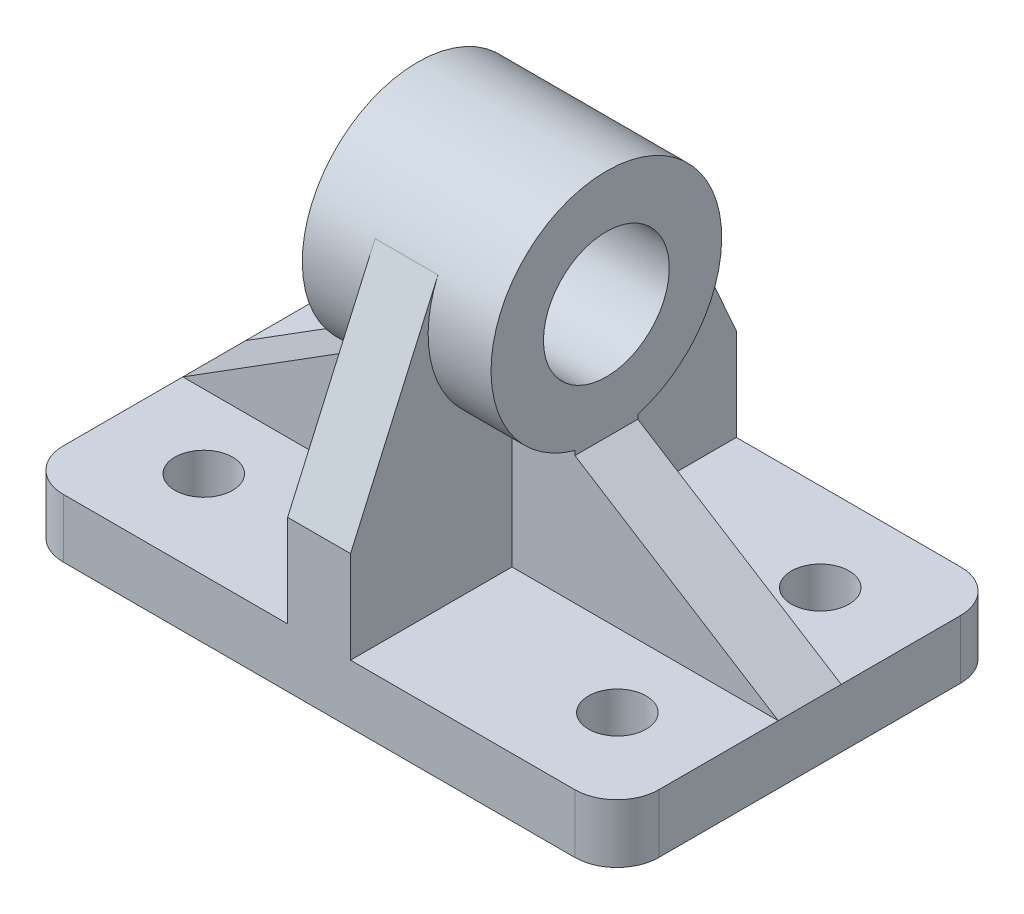
ISO-10303-21;
HEADER;
FILE_DESCRIPTION(('STEP AP214'),'2;1');
FILE_NAME('part.step','',(''),(''),'','','');
FILE_SCHEMA(('AUTOMOTIVE_DESIGN { 1 0 10303 214 1 1 1 1 }'));
ENDSEC;
DATA;
#1=APPLICATION_CONTEXT('core data for automotive mechanical design processes');
#2=APPLICATION_PROTOCOL_DEFINITION('international standard','automotive_design',2000,#1);
#3=PRODUCT_CONTEXT('',#1,'mechanical');
#4=PRODUCT('Part','Part','',(#3));
#5=PRODUCT_RELATED_PRODUCT_CATEGORY('part','',(#4));
#6=PRODUCT_DEFINITION_FORMATION('','',#4);
#7=PRODUCT_DEFINITION_CONTEXT('part definition',#1,'design');
#8=PRODUCT_DEFINITION('design','',#6,#7);
#9=PRODUCT_DEFINITION_SHAPE('','',#8);
#10=(LENGTH_UNIT() NAMED_UNIT(*) SI_UNIT(.MILLI.,.METRE.));
#11=(NAMED_UNIT(*) PLANE_ANGLE_UNIT() SI_UNIT($,.RADIAN.));
#12=(NAMED_UNIT(*) SI_UNIT($,.STERADIAN.) SOLID_ANGLE_UNIT());
#13=UNCERTAINTY_MEASURE_WITH_UNIT(LENGTH_MEASURE(1.E-05),#10,'distance_accuracy_value','');
#14=(GEOMETRIC_REPRESENTATION_CONTEXT(3) GLOBAL_UNCERTAINTY_ASSIGNED_CONTEXT((#13)) GLOBAL_UNIT_ASSIGNED_CONTEXT((#10,
#11,#12)) REPRESENTATION_CONTEXT('',''));
#15=CARTESIAN_POINT('',(0.,0.,0.));
#16=DIRECTION('',(0.,0.,1.));
#17=DIRECTION('',(1.,0.,0.));
#18=AXIS2_PLACEMENT_3D('',#15,#16,#17);
#19=CARTESIAN_POINT('',(0.,14.,0.));
#20=DIRECTION('',(0.,1.,0.));
#21=DIRECTION('',(0.,0.,1.));
#22=AXIS2_PLACEMENT_3D('',#19,#20,#21);
#23=PLANE('',#22);
#24=CARTESIAN_POINT('',(48.5,14.,-25.));
#25=DIRECTION('',(0.,1.,0.));
#26=DIRECTION('',(0.,0.,1.));
#27=AXIS2_PLACEMENT_3D('',#24,#25,#26);
#28=CIRCLE('',#27,6.87902882692954);
#29=CARTESIAN_POINT('',(48.5,14.,-18.1209711730705));
#30=VERTEX_POINT('',#29);
#31=EDGE_CURVE('E533',#30,#30,#28,.T.);
#32=ORIENTED_EDGE('',*,*,#31,.F.);
#33=EDGE_LOOP('',(#32));
#34=FACE_BOUND('',#33,.T.);
#35=DIRECTION('',(0.,0.,-1.));
#36=VECTOR('',#35,1.);
#37=CARTESIAN_POINT('',(7.5,14.,46.));
#38=LINE('',#37,#36);
#39=CARTESIAN_POINT('',(7.5,14.,-7.5));
#40=VERTEX_POINT('',#39);
#41=CARTESIAN_POINT('',(7.5,14.,-46.));
#42=VERTEX_POINT('',#41);
#43=EDGE_CURVE('E292',#40,#42,#38,.T.);
#44=ORIENTED_EDGE('',*,*,#43,.F.);
#45=DIRECTION('',(1.,0.,0.));
#46=VECTOR('',#45,1.);
#47=CARTESIAN_POINT('',(0.,14.,-7.5));
#48=LINE('',#47,#46);
#49=CARTESIAN_POINT('',(71.,14.,-7.5));
#50=VERTEX_POINT('',#49);
#51=EDGE_CURVE('E50',#40,#50,#48,.T.);
#52=ORIENTED_EDGE('',*,*,#51,.T.);
#53=DIRECTION('',(0.,0.,-1.));
#54=VECTOR('',#53,1.);
#55=CARTESIAN_POINT('',(71.,14.,-46.));
#56=LINE('',#55,#54);
#57=CARTESIAN_POINT('',(71.,14.,-36.));
#58=VERTEX_POINT('',#57);
#59=EDGE_CURVE('E331',#50,#58,#56,.T.);
#60=ORIENTED_EDGE('',*,*,#59,.T.);
#61=CARTESIAN_POINT('',(61.,14.,-36.));
#62=DIRECTION('',(0.,1.,0.));
#63=DIRECTION('',(0.,0.,1.));
#64=AXIS2_PLACEMENT_3D('',#61,#62,#63);
#65=CIRCLE('',#64,10.);
#66=CARTESIAN_POINT('',(61.,14.,-46.));
#67=VERTEX_POINT('',#66);
#68=EDGE_CURVE('E377',#58,#67,#65,.T.);
#69=ORIENTED_EDGE('',*,*,#68,.T.);
#70=DIRECTION('',(-1.,0.,0.));
#71=VECTOR('',#70,1.);
#72=CARTESIAN_POINT('',(-71.,14.,-46.));
#73=LINE('',#72,#71);
#74=EDGE_CURVE('E332',#67,#42,#73,.T.);
#75=ORIENTED_EDGE('',*,*,#74,.T.);
#76=EDGE_LOOP('',(#44,#52,#60,#69,#75));
#77=FACE_BOUND('',#76,.T.);
#78=ADVANCED_FACE('F35',(#34,#77),#23,.T.);
#79=CARTESIAN_POINT('',(7.5,72.,0.));
#80=DIRECTION('',(1.,0.,0.));
#81=DIRECTION('',(0.,0.,-1.));
#82=AXIS2_PLACEMENT_3D('',#79,#80,#81);
#83=PLANE('',#82);
#84=CARTESIAN_POINT('',(7.5,72.,0.));
#85=DIRECTION('',(-1.,0.,0.));
#86=DIRECTION('',(0.,0.,-1.));
#87=AXIS2_PLACEMENT_3D('',#84,#85,#86);
#88=CIRCLE('',#87,27.5);
#89=CARTESIAN_POINT('',(7.5,83.1270431608964,-25.148338125919));
#90=VERTEX_POINT('',#89);
#91=CARTESIAN_POINT('',(7.5,45.5424868893541,-7.5));
#92=VERTEX_POINT('',#91);
#93=EDGE_CURVE('E283',#90,#92,#88,.T.);
#94=ORIENTED_EDGE('',*,*,#93,.T.);
#95=DIRECTION('',(0.,-1.,0.));
#96=VECTOR('',#95,1.);
#97=CARTESIAN_POINT('',(7.5,72.,-7.5));
#98=LINE('',#97,#96);
#99=EDGE_CURVE('E231',#92,#40,#98,.T.);
#100=ORIENTED_EDGE('',*,*,#99,.T.);
#101=ORIENTED_EDGE('',*,*,#43,.T.);
#102=DIRECTION('',(0.,1.,0.));
#103=VECTOR('',#102,1.);
#104=CARTESIAN_POINT('',(7.5,14.,-46.));
#105=LINE('',#104,#103);
#106=CARTESIAN_POINT('',(7.5,36.,-46.));
#107=VERTEX_POINT('',#106);
#108=EDGE_CURVE('E296',#42,#107,#105,.T.);
#109=ORIENTED_EDGE('',*,*,#108,.T.);
#110=DIRECTION('',(0.,0.914485022760689,0.404619751305324));
#111=VECTOR('',#110,1.);
#112=CARTESIAN_POINT('',(7.5,36.,-46.));
#113=LINE('',#112,#111);
#114=EDGE_CURVE('E298',#107,#90,#113,.T.);
#115=ORIENTED_EDGE('',*,*,#114,.T.);
#116=EDGE_LOOP('',(#94,#100,#101,#109,#115));
#117=FACE_BOUND('',#116,.T.);
#118=ADVANCED_FACE('F475',(#117),#83,.T.);
#119=CARTESIAN_POINT('',(-48.5,14.,-25.));
#120=DIRECTION('',(0.,1.,0.));
#121=DIRECTION('',(0.,0.,1.));
#122=AXIS2_PLACEMENT_3D('',#119,#120,#121);
#123=CIRCLE('',#122,6.87902882692954);
#124=CARTESIAN_POINT('',(-48.5,14.,-18.1209711730705));
#125=VERTEX_POINT('',#124);
#126=EDGE_CURVE('E225',#125,#125,#123,.T.);
#127=ORIENTED_EDGE('',*,*,#126,.F.);
#128=EDGE_LOOP('',(#127));
#129=FACE_BOUND('',#128,.T.);
#130=DIRECTION('',(0.,0.,1.));
#131=VECTOR('',#130,1.);
#132=CARTESIAN_POINT('',(-71.,14.,-46.));
#133=LINE('',#132,#131);
#134=CARTESIAN_POINT('',(-71.,14.,-36.));
#135=VERTEX_POINT('',#134);
#136=CARTESIAN_POINT('',(-71.,14.,-7.5));
#137=VERTEX_POINT('',#136);
#138=EDGE_CURVE('E336',#135,#137,#133,.T.);
#139=ORIENTED_EDGE('',*,*,#138,.T.);
#140=DIRECTION('',(1.,0.,0.));
#141=VECTOR('',#140,1.);
#142=CARTESIAN_POINT('',(0.,14.,-7.5));
#143=LINE('',#142,#141);
#144=CARTESIAN_POINT('',(-7.5,14.,-7.5));
#145=VERTEX_POINT('',#144);
#146=EDGE_CURVE('E255',#137,#145,#143,.T.);
#147=ORIENTED_EDGE('',*,*,#146,.T.);
#148=DIRECTION('',(0.,0.,-1.));
#149=VECTOR('',#148,1.);
#150=CARTESIAN_POINT('',(-7.5,14.,46.));
#151=LINE('',#150,#149);
#152=CARTESIAN_POINT('',(-7.50000000000001,14.,-46.));
#153=VERTEX_POINT('',#152);
#154=EDGE_CURVE('E308',#145,#153,#151,.T.);
#155=ORIENTED_EDGE('',*,*,#154,.T.);
#156=CARTESIAN_POINT('',(-61.,14.,-46.));
#157=VERTEX_POINT('',#156);
#158=EDGE_CURVE('E330',#153,#157,#73,.T.);
#159=ORIENTED_EDGE('',*,*,#158,.T.);
#160=CARTESIAN_POINT('',(-61.,14.,-36.));
#161=DIRECTION('',(0.,1.,0.));
#162=DIRECTION('',(0.,0.,1.));
#163=AXIS2_PLACEMENT_3D('',#160,#161,#162);
#164=CIRCLE('',#163,10.);
#165=EDGE_CURVE('E379',#157,#135,#164,.T.);
#166=ORIENTED_EDGE('',*,*,#165,.T.);
#167=EDGE_LOOP('',(#139,#147,#155,#159,#166));
#168=FACE_BOUND('',#167,.T.);
#169=ADVANCED_FACE('F443',(#129,#168),#23,.T.);
#170=CARTESIAN_POINT('',(-7.5,72.,0.));
#171=DIRECTION('',(1.,0.,0.));
#172=DIRECTION('',(0.,0.,-1.));
#173=AXIS2_PLACEMENT_3D('',#170,#171,#172);
#174=PLANE('',#173);
#175=DIRECTION('',(0.,-1.,0.));
#176=VECTOR('',#175,1.);
#177=CARTESIAN_POINT('',(-7.5,72.,-7.5));
#178=LINE('',#177,#176);
#179=CARTESIAN_POINT('',(-7.5,45.5424868893541,-7.5));
#180=VERTEX_POINT('',#179);
#181=EDGE_CURVE('E260',#180,#145,#178,.T.);
#182=ORIENTED_EDGE('',*,*,#181,.F.);
#183=CARTESIAN_POINT('',(-7.5,72.,0.));
#184=DIRECTION('',(-1.,0.,0.));
#185=DIRECTION('',(0.,0.,-1.));
#186=AXIS2_PLACEMENT_3D('',#183,#184,#185);
#187=CIRCLE('',#186,27.5);
#188=CARTESIAN_POINT('',(-7.5,83.1270431608964,-25.148338125919));
#189=VERTEX_POINT('',#188);
#190=EDGE_CURVE('E301',#189,#180,#187,.T.);
#191=ORIENTED_EDGE('',*,*,#190,.F.);
#192=DIRECTION('',(0.,0.914485022760689,0.404619751305324));
#193=VECTOR('',#192,1.);
#194=CARTESIAN_POINT('',(-7.5,36.,-46.));
#195=LINE('',#194,#193);
#196=CARTESIAN_POINT('',(-7.5,36.,-46.));
#197=VERTEX_POINT('',#196);
#198=EDGE_CURVE('E314',#197,#189,#195,.T.);
#199=ORIENTED_EDGE('',*,*,#198,.F.);
#200=DIRECTION('',(0.,1.,0.));
#201=VECTOR('',#200,1.);
#202=CARTESIAN_POINT('',(-7.5,14.,-46.));
#203=LINE('',#202,#201);
#204=EDGE_CURVE('E312',#153,#197,#203,.T.);
#205=ORIENTED_EDGE('',*,*,#204,.F.);
#206=ORIENTED_EDGE('',*,*,#154,.F.);
#207=EDGE_LOOP('',(#182,#191,#199,#205,#206));
#208=FACE_BOUND('',#207,.T.);
#209=ADVANCED_FACE('F452',(#208),#174,.F.);
#210=CARTESIAN_POINT('',(-48.5,14.,25.));
#211=DIRECTION('',(0.,1.,0.));
#212=DIRECTION('',(0.,0.,1.));
#213=AXIS2_PLACEMENT_3D('',#210,#211,#212);
#214=CIRCLE('',#213,6.87902882692954);
#215=CARTESIAN_POINT('',(-48.5,14.,31.8790288269295));
#216=VERTEX_POINT('',#215);
#217=EDGE_CURVE('E525',#216,#216,#214,.T.);
#218=ORIENTED_EDGE('',*,*,#217,.F.);
#219=EDGE_LOOP('',(#218));
#220=FACE_BOUND('',#219,.T.);
#221=DIRECTION('',(1.,0.,0.));
#222=VECTOR('',#221,1.);
#223=CARTESIAN_POINT('',(0.,14.,7.5));
#224=LINE('',#223,#222);
#225=CARTESIAN_POINT('',(-71.,14.,7.5));
#226=VERTEX_POINT('',#225);
#227=CARTESIAN_POINT('',(-7.5,14.,7.5));
#228=VERTEX_POINT('',#227);
#229=EDGE_CURVE('E259',#226,#228,#224,.T.);
#230=ORIENTED_EDGE('',*,*,#229,.F.);
#231=CARTESIAN_POINT('',(-71.,14.,36.));
#232=VERTEX_POINT('',#231);
#233=EDGE_CURVE('E335',#226,#232,#133,.T.);
#234=ORIENTED_EDGE('',*,*,#233,.T.);
#235=CARTESIAN_POINT('',(-61.,14.,36.));
#236=DIRECTION('',(0.,1.,0.));
#237=DIRECTION('',(0.,0.,1.));
#238=AXIS2_PLACEMENT_3D('',#235,#236,#237);
#239=CIRCLE('',#238,10.);
#240=CARTESIAN_POINT('',(-61.,14.,46.));
#241=VERTEX_POINT('',#240);
#242=EDGE_CURVE('E373',#232,#241,#239,.T.);
#243=ORIENTED_EDGE('',*,*,#242,.T.);
#244=DIRECTION('',(1.,0.,0.));
#245=VECTOR('',#244,1.);
#246=CARTESIAN_POINT('',(-71.,14.,46.));
#247=LINE('',#246,#245);
#248=CARTESIAN_POINT('',(-7.50000000000001,14.,46.));
#249=VERTEX_POINT('',#248);
#250=EDGE_CURVE('E340',#241,#249,#247,.T.);
#251=ORIENTED_EDGE('',*,*,#250,.T.);
#252=EDGE_CURVE('E309',#249,#228,#151,.T.);
#253=ORIENTED_EDGE('',*,*,#252,.T.);
#254=EDGE_LOOP('',(#230,#234,#243,#251,#253));
#255=FACE_BOUND('',#254,.T.);
#256=ADVANCED_FACE('F425',(#220,#255),#23,.T.);
#257=CARTESIAN_POINT('',(71.,14.,-46.));
#258=DIRECTION('',(-1.,0.,0.));
#259=DIRECTION('',(0.,0.,1.));
#260=AXIS2_PLACEMENT_3D('',#257,#258,#259);
#261=PLANE('',#260);
#262=DIRECTION('',(0.,0.,-1.));
#263=VECTOR('',#262,1.);
#264=CARTESIAN_POINT('',(71.,0.,-46.));
#265=LINE('',#264,#263);
#266=CARTESIAN_POINT('',(71.,0.,36.));
#267=VERTEX_POINT('',#266);
#268=CARTESIAN_POINT('',(71.,0.,-36.));
#269=VERTEX_POINT('',#268);
#270=EDGE_CURVE('E327',#267,#269,#265,.T.);
#271=ORIENTED_EDGE('',*,*,#270,.T.);
#272=DIRECTION('',(0.,-1.,0.));
#273=VECTOR('',#272,1.);
#274=CARTESIAN_POINT('',(71.,14.,-36.));
#275=LINE('',#274,#273);
#276=EDGE_CURVE('E384',#269,#58,#275,.F.);
#277=ORIENTED_EDGE('',*,*,#276,.T.);
#278=ORIENTED_EDGE('',*,*,#59,.F.);
#279=DIRECTION('',(0.,0.,-1.));
#280=VECTOR('',#279,1.);
#281=CARTESIAN_POINT('',(71.,14.,0.));
#282=LINE('',#281,#280);
#283=CARTESIAN_POINT('',(71.,14.,7.5));
#284=VERTEX_POINT('',#283);
#285=EDGE_CURVE('E57',#284,#50,#282,.T.);
#286=ORIENTED_EDGE('',*,*,#285,.F.);
#287=CARTESIAN_POINT('',(71.,14.,36.));
#288=VERTEX_POINT('',#287);
#289=EDGE_CURVE('E328',#288,#284,#56,.T.);
#290=ORIENTED_EDGE('',*,*,#289,.F.);
#291=DIRECTION('',(0.,-1.,0.));
#292=VECTOR('',#291,1.);
#293=CARTESIAN_POINT('',(71.,14.,36.));
#294=LINE('',#293,#292);
#295=EDGE_CURVE('E381',#288,#267,#294,.T.);
#296=ORIENTED_EDGE('',*,*,#295,.T.);
#297=EDGE_LOOP('',(#271,#277,#278,#286,#290,#296));
#298=FACE_BOUND('',#297,.T.);
#299=ADVANCED_FACE('F404',(#298),#261,.F.);
#300=CARTESIAN_POINT('',(-71.,14.,-46.));
#301=DIRECTION('',(0.,0.,1.));
#302=DIRECTION('',(1.,0.,0.));
#303=AXIS2_PLACEMENT_3D('',#300,#301,#302);
#304=PLANE('',#303);
#305=DIRECTION('',(-1.,0.,0.));
#306=VECTOR('',#305,1.);
#307=CARTESIAN_POINT('',(-71.,0.,-46.));
#308=LINE('',#307,#306);
#309=CARTESIAN_POINT('',(61.,0.,-46.));
#310=VERTEX_POINT('',#309);
#311=CARTESIAN_POINT('',(-61.,0.,-46.));
#312=VERTEX_POINT('',#311);
#313=EDGE_CURVE('E344',#310,#312,#308,.T.);
#314=ORIENTED_EDGE('',*,*,#313,.T.);
#315=DIRECTION('',(0.,-1.,0.));
#316=VECTOR('',#315,1.);
#317=CARTESIAN_POINT('',(-61.,14.,-46.));
#318=LINE('',#317,#316);
#319=EDGE_CURVE('E370',#312,#157,#318,.F.);
#320=ORIENTED_EDGE('',*,*,#319,.T.);
#321=ORIENTED_EDGE('',*,*,#158,.F.);
#322=ORIENTED_EDGE('',*,*,#204,.T.);
#323=DIRECTION('',(-1.,0.,0.));
#324=VECTOR('',#323,1.);
#325=CARTESIAN_POINT('',(7.5,36.,-46.));
#326=LINE('',#325,#324);
#327=EDGE_CURVE('E318',#107,#197,#326,.T.);
#328=ORIENTED_EDGE('',*,*,#327,.F.);
#329=ORIENTED_EDGE('',*,*,#108,.F.);
#330=ORIENTED_EDGE('',*,*,#74,.F.);
#331=DIRECTION('',(0.,-1.,0.));
#332=VECTOR('',#331,1.);
#333=CARTESIAN_POINT('',(61.,14.,-46.));
#334=LINE('',#333,#332);
#335=EDGE_CURVE('E367',#67,#310,#334,.T.);
#336=ORIENTED_EDGE('',*,*,#335,.T.);
#337=EDGE_LOOP('',(#314,#320,#321,#322,#328,#329,#330,#336));
#338=FACE_BOUND('',#337,.T.);
#339=ADVANCED_FACE('F457',(#338),#304,.F.);
#340=CARTESIAN_POINT('',(-71.,14.,-46.));
#341=DIRECTION('',(1.,0.,0.));
#342=DIRECTION('',(0.,0.,-1.));
#343=AXIS2_PLACEMENT_3D('',#340,#341,#342);
#344=PLANE('',#343);
#345=ORIENTED_EDGE('',*,*,#233,.F.);
#346=DIRECTION('',(0.,0.,-1.));
#347=VECTOR('',#346,1.);
#348=CARTESIAN_POINT('',(-71.,14.,-46.));
#349=LINE('',#348,#347);
#350=EDGE_CURVE('E266',#137,#226,#349,.F.);
#351=ORIENTED_EDGE('',*,*,#350,.F.);
#352=ORIENTED_EDGE('',*,*,#138,.F.);
#353=DIRECTION('',(0.,-1.,0.));
#354=VECTOR('',#353,1.);
#355=CARTESIAN_POINT('',(-71.,14.,-36.));
#356=LINE('',#355,#354);
#357=CARTESIAN_POINT('',(-71.,0.,-36.));
#358=VERTEX_POINT('',#357);
#359=EDGE_CURVE('E354',#135,#358,#356,.T.);
#360=ORIENTED_EDGE('',*,*,#359,.T.);
#361=DIRECTION('',(0.,0.,1.));
#362=VECTOR('',#361,1.);
#363=CARTESIAN_POINT('',(-71.,0.,-46.));
#364=LINE('',#363,#362);
#365=CARTESIAN_POINT('',(-71.,0.,36.));
#366=VERTEX_POINT('',#365);
#367=EDGE_CURVE('E347',#358,#366,#364,.T.);
#368=ORIENTED_EDGE('',*,*,#367,.T.);
#369=DIRECTION('',(0.,-1.,0.));
#370=VECTOR('',#369,1.);
#371=CARTESIAN_POINT('',(-71.,14.,36.));
#372=LINE('',#371,#370);
#373=EDGE_CURVE('E342',#366,#232,#372,.F.);
#374=ORIENTED_EDGE('',*,*,#373,.T.);
#375=EDGE_LOOP('',(#345,#351,#352,#360,#368,#374));
#376=FACE_BOUND('',#375,.T.);
#377=ADVANCED_FACE('F439',(#376),#344,.F.);
#378=CARTESIAN_POINT('',(-71.,14.,46.));
#379=DIRECTION('',(0.,0.,-1.));
#380=DIRECTION('',(-1.,0.,0.));
#381=AXIS2_PLACEMENT_3D('',#378,#379,#380);
#382=PLANE('',#381);
#383=DIRECTION('',(1.,0.,0.));
#384=VECTOR('',#383,1.);
#385=CARTESIAN_POINT('',(-71.,0.,46.));
#386=LINE('',#385,#384);
#387=CARTESIAN_POINT('',(-61.,0.,46.));
#388=VERTEX_POINT('',#387);
#389=CARTESIAN_POINT('',(61.,0.,46.));
#390=VERTEX_POINT('',#389);
#391=EDGE_CURVE('E349',#388,#390,#386,.T.);
#392=ORIENTED_EDGE('',*,*,#391,.T.);
#393=DIRECTION('',(0.,-1.,0.));
#394=VECTOR('',#393,1.);
#395=CARTESIAN_POINT('',(61.,14.,46.));
#396=LINE('',#395,#394);
#397=CARTESIAN_POINT('',(61.,14.,46.));
#398=VERTEX_POINT('',#397);
#399=EDGE_CURVE('E11',#390,#398,#396,.F.);
#400=ORIENTED_EDGE('',*,*,#399,.T.);
#401=CARTESIAN_POINT('',(7.50000000000001,14.,46.));
#402=VERTEX_POINT('',#401);
#403=EDGE_CURVE('E339',#402,#398,#247,.T.);
#404=ORIENTED_EDGE('',*,*,#403,.F.);
#405=DIRECTION('',(0.,-1.,0.));
#406=VECTOR('',#405,1.);
#407=CARTESIAN_POINT('',(7.5,36.,46.));
#408=LINE('',#407,#406);
#409=CARTESIAN_POINT('',(7.5,36.,46.));
#410=VERTEX_POINT('',#409);
#411=EDGE_CURVE('E289',#410,#402,#408,.T.);
#412=ORIENTED_EDGE('',*,*,#411,.F.);
#413=DIRECTION('',(-1.,0.,0.));
#414=VECTOR('',#413,1.);
#415=CARTESIAN_POINT('',(7.5,36.,46.));
#416=LINE('',#415,#414);
#417=CARTESIAN_POINT('',(-7.5,36.,46.));
#418=VERTEX_POINT('',#417);
#419=EDGE_CURVE('E321',#410,#418,#416,.T.);
#420=ORIENTED_EDGE('',*,*,#419,.T.);
#421=DIRECTION('',(0.,-1.,0.));
#422=VECTOR('',#421,1.);
#423=CARTESIAN_POINT('',(-7.5,36.,46.));
#424=LINE('',#423,#422);
#425=EDGE_CURVE('E305',#418,#249,#424,.T.);
#426=ORIENTED_EDGE('',*,*,#425,.T.);
#427=ORIENTED_EDGE('',*,*,#250,.F.);
#428=DIRECTION('',(0.,-1.,0.));
#429=VECTOR('',#428,1.);
#430=CARTESIAN_POINT('',(-61.,14.,46.));
#431=LINE('',#430,#429);
#432=EDGE_CURVE('E43',#241,#388,#431,.T.);
#433=ORIENTED_EDGE('',*,*,#432,.T.);
#434=EDGE_LOOP('',(#392,#400,#404,#412,#420,#426,#427,#433));
#435=FACE_BOUND('',#434,.T.);
#436=ADVANCED_FACE('F391',(#435),#382,.F.);
#437=CARTESIAN_POINT('',(50.1214026438332,14.,25.));
#438=DIRECTION('',(0.,1.,0.));
#439=DIRECTION('',(0.,0.,1.));
#440=AXIS2_PLACEMENT_3D('',#437,#438,#439);
#441=CIRCLE('',#440,6.87902882692954);
#442=CARTESIAN_POINT('',(50.1214026438332,14.,31.8790288269295));
#443=VERTEX_POINT('',#442);
#444=EDGE_CURVE('E541',#443,#443,#441,.T.);
#445=ORIENTED_EDGE('',*,*,#444,.F.);
#446=EDGE_LOOP('',(#445));
#447=FACE_BOUND('',#446,.T.);
#448=DIRECTION('',(1.,0.,0.));
#449=VECTOR('',#448,1.);
#450=CARTESIAN_POINT('',(0.,14.,7.5));
#451=LINE('',#450,#449);
#452=CARTESIAN_POINT('',(7.5,14.,7.5));
#453=VERTEX_POINT('',#452);
#454=EDGE_CURVE('E216',#453,#284,#451,.T.);
#455=ORIENTED_EDGE('',*,*,#454,.F.);
#456=EDGE_CURVE('E293',#402,#453,#38,.T.);
#457=ORIENTED_EDGE('',*,*,#456,.F.);
#458=ORIENTED_EDGE('',*,*,#403,.T.);
#459=CARTESIAN_POINT('',(61.,14.,36.));
#460=DIRECTION('',(0.,1.,0.));
#461=DIRECTION('',(0.,0.,1.));
#462=AXIS2_PLACEMENT_3D('',#459,#460,#461);
#463=CIRCLE('',#462,10.);
#464=EDGE_CURVE('E375',#398,#288,#463,.T.);
#465=ORIENTED_EDGE('',*,*,#464,.T.);
#466=ORIENTED_EDGE('',*,*,#289,.T.);
#467=EDGE_LOOP('',(#455,#457,#458,#465,#466));
#468=FACE_BOUND('',#467,.T.);
#469=ADVANCED_FACE('F406',(#447,#468),#23,.T.);
#470=CARTESIAN_POINT('',(0.,0.,0.));
#471=DIRECTION('',(0.,1.,0.));
#472=DIRECTION('',(0.,0.,1.));
#473=AXIS2_PLACEMENT_3D('',#470,#471,#472);
#474=PLANE('',#473);
#475=CARTESIAN_POINT('',(-48.5,0.,25.));
#476=DIRECTION('',(0.,1.,0.));
#477=DIRECTION('',(0.,0.,1.));
#478=AXIS2_PLACEMENT_3D('',#475,#476,#477);
#479=CIRCLE('',#478,6.87902882692954);
#480=CARTESIAN_POINT('',(-48.5,0.,31.8790288269295));
#481=VERTEX_POINT('',#480);
#482=EDGE_CURVE('E527',#481,#481,#479,.T.);
#483=ORIENTED_EDGE('',*,*,#482,.T.);
#484=EDGE_LOOP('',(#483));
#485=FACE_BOUND('',#484,.T.);
#486=CARTESIAN_POINT('',(48.5,0.,-25.));
#487=DIRECTION('',(0.,1.,0.));
#488=DIRECTION('',(0.,0.,1.));
#489=AXIS2_PLACEMENT_3D('',#486,#487,#488);
#490=CIRCLE('',#489,6.87902882692954);
#491=CARTESIAN_POINT('',(48.5,0.,-18.1209711730705));
#492=VERTEX_POINT('',#491);
#493=EDGE_CURVE('E528',#492,#492,#490,.T.);
#494=ORIENTED_EDGE('',*,*,#493,.T.);
#495=EDGE_LOOP('',(#494));
#496=FACE_BOUND('',#495,.T.);
#497=CARTESIAN_POINT('',(50.1214026438332,0.,25.));
#498=DIRECTION('',(0.,1.,0.));
#499=DIRECTION('',(0.,0.,1.));
#500=AXIS2_PLACEMENT_3D('',#497,#498,#499);
#501=CIRCLE('',#500,6.87902882692954);
#502=CARTESIAN_POINT('',(50.1214026438332,0.,31.8790288269295));
#503=VERTEX_POINT('',#502);
#504=EDGE_CURVE('E538',#503,#503,#501,.T.);
#505=ORIENTED_EDGE('',*,*,#504,.T.);
#506=EDGE_LOOP('',(#505));
#507=FACE_BOUND('',#506,.T.);
#508=CARTESIAN_POINT('',(-48.5,0.,-25.));
#509=DIRECTION('',(0.,1.,0.));
#510=DIRECTION('',(0.,0.,1.));
#511=AXIS2_PLACEMENT_3D('',#508,#509,#510);
#512=CIRCLE('',#511,6.87902882692954);
#513=CARTESIAN_POINT('',(-48.5,0.,-18.1209711730705));
#514=VERTEX_POINT('',#513);
#515=EDGE_CURVE('E228',#514,#514,#512,.T.);
#516=ORIENTED_EDGE('',*,*,#515,.T.);
#517=EDGE_LOOP('',(#516));
#518=FACE_BOUND('',#517,.T.);
#519=CARTESIAN_POINT('',(-61.,0.,36.));
#520=DIRECTION('',(0.,1.,0.));
#521=DIRECTION('',(0.,0.,1.));
#522=AXIS2_PLACEMENT_3D('',#519,#520,#521);
#523=CIRCLE('',#522,10.);
#524=EDGE_CURVE('E357',#388,#366,#523,.F.);
#525=ORIENTED_EDGE('',*,*,#524,.T.);
#526=ORIENTED_EDGE('',*,*,#367,.F.);
#527=CARTESIAN_POINT('',(-61.,0.,-36.));
#528=DIRECTION('',(0.,1.,0.));
#529=DIRECTION('',(0.,0.,1.));
#530=AXIS2_PLACEMENT_3D('',#527,#528,#529);
#531=CIRCLE('',#530,10.);
#532=EDGE_CURVE('E365',#358,#312,#531,.F.);
#533=ORIENTED_EDGE('',*,*,#532,.T.);
#534=ORIENTED_EDGE('',*,*,#313,.F.);
#535=CARTESIAN_POINT('',(61.,0.,-36.));
#536=DIRECTION('',(0.,1.,0.));
#537=DIRECTION('',(0.,0.,1.));
#538=AXIS2_PLACEMENT_3D('',#535,#536,#537);
#539=CIRCLE('',#538,10.);
#540=EDGE_CURVE('E362',#310,#269,#539,.F.);
#541=ORIENTED_EDGE('',*,*,#540,.T.);
#542=ORIENTED_EDGE('',*,*,#270,.F.);
#543=CARTESIAN_POINT('',(61.,0.,36.));
#544=DIRECTION('',(0.,1.,0.));
#545=DIRECTION('',(0.,0.,1.));
#546=AXIS2_PLACEMENT_3D('',#543,#544,#545);
#547=CIRCLE('',#546,10.);
#548=EDGE_CURVE('E360',#267,#390,#547,.F.);
#549=ORIENTED_EDGE('',*,*,#548,.T.);
#550=ORIENTED_EDGE('',*,*,#391,.F.);
#551=EDGE_LOOP('',(#525,#526,#533,#534,#541,#542,#549,#550));
#552=FACE_BOUND('',#551,.T.);
#553=ADVANCED_FACE('F396',(#485,#496,#507,#518,#552),#474,.F.);
#554=CARTESIAN_POINT('',(-61.,14.,-36.));
#555=DIRECTION('',(0.,-1.,0.));
#556=DIRECTION('',(0.,0.,-1.));
#557=AXIS2_PLACEMENT_3D('',#554,#555,#556);
#558=CYLINDRICAL_SURFACE('',#557,10.);
#559=ORIENTED_EDGE('',*,*,#165,.F.);
#560=ORIENTED_EDGE('',*,*,#319,.F.);
#561=ORIENTED_EDGE('',*,*,#532,.F.);
#562=ORIENTED_EDGE('',*,*,#359,.F.);
#563=EDGE_LOOP('',(#559,#560,#561,#562));
#564=FACE_BOUND('',#563,.T.);
#565=ADVANCED_FACE('F462',(#564),#558,.T.);
#566=CARTESIAN_POINT('',(61.,14.,-36.));
#567=DIRECTION('',(0.,-1.,0.));
#568=DIRECTION('',(0.,0.,-1.));
#569=AXIS2_PLACEMENT_3D('',#566,#567,#568);
#570=CYLINDRICAL_SURFACE('',#569,10.);
#571=ORIENTED_EDGE('',*,*,#68,.F.);
#572=ORIENTED_EDGE('',*,*,#276,.F.);
#573=ORIENTED_EDGE('',*,*,#540,.F.);
#574=ORIENTED_EDGE('',*,*,#335,.F.);
#575=EDGE_LOOP('',(#571,#572,#573,#574));
#576=FACE_BOUND('',#575,.T.);
#577=ADVANCED_FACE('F467',(#576),#570,.T.);
#578=CARTESIAN_POINT('',(61.,14.,36.));
#579=DIRECTION('',(0.,-1.,0.));
#580=DIRECTION('',(0.,0.,-1.));
#581=AXIS2_PLACEMENT_3D('',#578,#579,#580);
#582=CYLINDRICAL_SURFACE('',#581,10.);
#583=ORIENTED_EDGE('',*,*,#464,.F.);
#584=ORIENTED_EDGE('',*,*,#399,.F.);
#585=ORIENTED_EDGE('',*,*,#548,.F.);
#586=ORIENTED_EDGE('',*,*,#295,.F.);
#587=EDGE_LOOP('',(#583,#584,#585,#586));
#588=FACE_BOUND('',#587,.T.);
#589=ADVANCED_FACE('F403',(#588),#582,.T.);
#590=CARTESIAN_POINT('',(-61.,14.,36.));
#591=DIRECTION('',(0.,-1.,0.));
#592=DIRECTION('',(0.,0.,-1.));
#593=AXIS2_PLACEMENT_3D('',#590,#591,#592);
#594=CYLINDRICAL_SURFACE('',#593,10.);
#595=ORIENTED_EDGE('',*,*,#242,.F.);
#596=ORIENTED_EDGE('',*,*,#373,.F.);
#597=ORIENTED_EDGE('',*,*,#524,.F.);
#598=ORIENTED_EDGE('',*,*,#432,.F.);
#599=EDGE_LOOP('',(#595,#596,#597,#598));
#600=FACE_BOUND('',#599,.T.);
#601=ADVANCED_FACE('F37',(#600),#594,.T.);
#602=CARTESIAN_POINT('',(7.5,83.1270431608964,25.1483381259189));
#603=DIRECTION('',(0.,-0.404619751305324,-0.914485022760689));
#604=DIRECTION('',(0.,0.914485022760689,-0.404619751305324));
#605=AXIS2_PLACEMENT_3D('',#602,#603,#604);
#606=PLANE('',#605);
#607=DIRECTION('',(0.,-0.914485022760689,0.404619751305324));
#608=VECTOR('',#607,1.);
#609=CARTESIAN_POINT('',(-7.5,83.1270431608964,25.1483381259189));
#610=LINE('',#609,#608);
#611=CARTESIAN_POINT('',(-7.5,83.1270431608964,25.1483381259189));
#612=VERTEX_POINT('',#611);
#613=EDGE_CURVE('E303',#612,#418,#610,.T.);
#614=ORIENTED_EDGE('',*,*,#613,.T.);
#615=ORIENTED_EDGE('',*,*,#419,.F.);
#616=DIRECTION('',(0.,-0.914485022760689,0.404619751305324));
#617=VECTOR('',#616,1.);
#618=CARTESIAN_POINT('',(7.5,83.1270431608964,25.1483381259189));
#619=LINE('',#618,#617);
#620=CARTESIAN_POINT('',(7.5,83.1270431608964,25.1483381259189));
#621=VERTEX_POINT('',#620);
#622=EDGE_CURVE('E286',#621,#410,#619,.T.);
#623=ORIENTED_EDGE('',*,*,#622,.F.);
#624=DIRECTION('',(-1.,0.,0.));
#625=VECTOR('',#624,1.);
#626=CARTESIAN_POINT('',(7.5,83.1270431608964,25.1483381259189));
#627=LINE('',#626,#625);
#628=EDGE_CURVE('E324',#621,#612,#627,.T.);
#629=ORIENTED_EDGE('',*,*,#628,.T.);
#630=EDGE_LOOP('',(#614,#615,#623,#629));
#631=FACE_BOUND('',#630,.T.);
#632=ADVANCED_FACE('F416',(#631),#606,.F.);
#633=CARTESIAN_POINT('',(7.5,36.,-46.));
#634=DIRECTION('',(0.,-0.404619751305324,0.914485022760689));
#635=DIRECTION('',(0.,-0.914485022760689,-0.404619751305324));
#636=AXIS2_PLACEMENT_3D('',#633,#634,#635);
#637=PLANE('',#636);
#638=ORIENTED_EDGE('',*,*,#198,.T.);
#639=DIRECTION('',(-1.,0.,0.));
#640=VECTOR('',#639,1.);
#641=CARTESIAN_POINT('',(7.5,83.1270431608964,-25.148338125919));
#642=LINE('',#641,#640);
#643=EDGE_CURVE('E300',#90,#189,#642,.T.);
#644=ORIENTED_EDGE('',*,*,#643,.F.);
#645=ORIENTED_EDGE('',*,*,#114,.F.);
#646=ORIENTED_EDGE('',*,*,#327,.T.);
#647=EDGE_LOOP('',(#638,#644,#645,#646));
#648=FACE_BOUND('',#647,.T.);
#649=ADVANCED_FACE('F480',(#648),#637,.F.);
#650=DIRECTION('',(0.,-1.,0.));
#651=VECTOR('',#650,1.);
#652=CARTESIAN_POINT('',(7.5,72.,7.5));
#653=LINE('',#652,#651);
#654=CARTESIAN_POINT('',(7.5,45.5424868893541,7.5));
#655=VERTEX_POINT('',#654);
#656=EDGE_CURVE('E237',#655,#453,#653,.T.);
#657=ORIENTED_EDGE('',*,*,#656,.F.);
#658=EDGE_CURVE('E287',#655,#621,#88,.T.);
#659=ORIENTED_EDGE('',*,*,#658,.T.);
#660=ORIENTED_EDGE('',*,*,#622,.T.);
#661=ORIENTED_EDGE('',*,*,#411,.T.);
#662=ORIENTED_EDGE('',*,*,#456,.T.);
#663=EDGE_LOOP('',(#657,#659,#660,#661,#662));
#664=FACE_BOUND('',#663,.T.);
#665=ADVANCED_FACE('F410',(#664),#83,.T.);
#666=CARTESIAN_POINT('',(-7.5,45.5424868893541,7.5));
#667=VERTEX_POINT('',#666);
#668=EDGE_CURVE('E281',#667,#612,#187,.T.);
#669=ORIENTED_EDGE('',*,*,#668,.F.);
#670=DIRECTION('',(0.,-1.,0.));
#671=VECTOR('',#670,1.);
#672=CARTESIAN_POINT('',(-7.5,72.,7.5));
#673=LINE('',#672,#671);
#674=EDGE_CURVE('E267',#667,#228,#673,.T.);
#675=ORIENTED_EDGE('',*,*,#674,.T.);
#676=ORIENTED_EDGE('',*,*,#252,.F.);
#677=ORIENTED_EDGE('',*,*,#425,.F.);
#678=ORIENTED_EDGE('',*,*,#613,.F.);
#679=EDGE_LOOP('',(#669,#675,#676,#677,#678));
#680=FACE_BOUND('',#679,.T.);
#681=ADVANCED_FACE('F422',(#680),#174,.F.);
#682=CARTESIAN_POINT('',(22.5,72.,0.));
#683=DIRECTION('',(1.,0.,0.));
#684=DIRECTION('',(0.,0.,-1.));
#685=AXIS2_PLACEMENT_3D('',#682,#683,#684);
#686=PLANE('',#685);
#687=CARTESIAN_POINT('',(22.5,72.,0.));
#688=DIRECTION('',(1.,0.,0.));
#689=DIRECTION('',(0.,0.,-1.));
#690=AXIS2_PLACEMENT_3D('',#687,#688,#689);
#691=CIRCLE('',#690,15.);
#692=CARTESIAN_POINT('',(22.5,72.,15.));
#693=VERTEX_POINT('',#692);
#694=EDGE_CURVE('E274',#693,#693,#691,.T.);
#695=ORIENTED_EDGE('',*,*,#694,.F.);
#696=EDGE_LOOP('',(#695));
#697=FACE_BOUND('',#696,.T.);
#698=CARTESIAN_POINT('',(22.5,72.,0.));
#699=DIRECTION('',(1.,0.,0.));
#700=DIRECTION('',(0.,0.,-1.));
#701=AXIS2_PLACEMENT_3D('',#698,#699,#700);
#702=CIRCLE('',#701,27.5);
#703=CARTESIAN_POINT('',(22.5,45.5424868893541,-7.5));
#704=VERTEX_POINT('',#703);
#705=CARTESIAN_POINT('',(22.5,45.5424868893541,7.5));
#706=VERTEX_POINT('',#705);
#707=EDGE_CURVE('E219',#704,#706,#702,.T.);
#708=ORIENTED_EDGE('',*,*,#707,.T.);
#709=DIRECTION('',(0.,1.,0.));
#710=VECTOR('',#709,1.);
#711=CARTESIAN_POINT('',(22.5,49.75,7.5));
#712=LINE('',#711,#710);
#713=CARTESIAN_POINT('',(22.5,44.5,7.5));
#714=VERTEX_POINT('',#713);
#715=EDGE_CURVE('E214',#714,#706,#712,.T.);
#716=ORIENTED_EDGE('',*,*,#715,.F.);
#717=DIRECTION('',(0.,0.,1.));
#718=VECTOR('',#717,1.);
#719=CARTESIAN_POINT('',(22.5,44.5,0.));
#720=LINE('',#719,#718);
#721=CARTESIAN_POINT('',(22.5,44.5,-7.5));
#722=VERTEX_POINT('',#721);
#723=EDGE_CURVE('E198',#722,#714,#720,.T.);
#724=ORIENTED_EDGE('',*,*,#723,.F.);
#725=DIRECTION('',(0.,1.,0.));
#726=VECTOR('',#725,1.);
#727=CARTESIAN_POINT('',(22.5,49.75,-7.5));
#728=LINE('',#727,#726);
#729=EDGE_CURVE('E222',#722,#704,#728,.T.);
#730=ORIENTED_EDGE('',*,*,#729,.T.);
#731=EDGE_LOOP('',(#708,#716,#724,#730));
#732=FACE_BOUND('',#731,.T.);
#733=ADVANCED_FACE('F218',(#697,#732),#686,.T.);
#734=CARTESIAN_POINT('',(-22.5,72.,0.));
#735=DIRECTION('',(1.,0.,0.));
#736=DIRECTION('',(0.,0.,-1.));
#737=AXIS2_PLACEMENT_3D('',#734,#735,#736);
#738=PLANE('',#737);
#739=CARTESIAN_POINT('',(-22.5,72.,0.));
#740=DIRECTION('',(1.,0.,0.));
#741=DIRECTION('',(0.,0.,-1.));
#742=AXIS2_PLACEMENT_3D('',#739,#740,#741);
#743=CIRCLE('',#742,15.);
#744=CARTESIAN_POINT('',(-22.5,72.,15.));
#745=VERTEX_POINT('',#744);
#746=EDGE_CURVE('E273',#745,#745,#743,.T.);
#747=ORIENTED_EDGE('',*,*,#746,.T.);
#748=EDGE_LOOP('',(#747));
#749=FACE_BOUND('',#748,.T.);
#750=DIRECTION('',(0.,1.,0.));
#751=VECTOR('',#750,1.);
#752=CARTESIAN_POINT('',(-22.5,49.75,7.5));
#753=LINE('',#752,#751);
#754=CARTESIAN_POINT('',(-22.5,44.5,7.5));
#755=VERTEX_POINT('',#754);
#756=CARTESIAN_POINT('',(-22.5,45.5424868893541,7.5));
#757=VERTEX_POINT('',#756);
#758=EDGE_CURVE('E247',#755,#757,#753,.T.);
#759=ORIENTED_EDGE('',*,*,#758,.T.);
#760=CARTESIAN_POINT('',(-22.5,72.,0.));
#761=DIRECTION('',(1.,0.,0.));
#762=DIRECTION('',(0.,0.,-1.));
#763=AXIS2_PLACEMENT_3D('',#760,#761,#762);
#764=CIRCLE('',#763,27.5);
#765=CARTESIAN_POINT('',(-22.5,45.5424868893541,-7.5));
#766=VERTEX_POINT('',#765);
#767=EDGE_CURVE('E277',#766,#757,#764,.T.);
#768=ORIENTED_EDGE('',*,*,#767,.F.);
#769=DIRECTION('',(0.,1.,0.));
#770=VECTOR('',#769,1.);
#771=CARTESIAN_POINT('',(-22.5,49.75,-7.5));
#772=LINE('',#771,#770);
#773=CARTESIAN_POINT('',(-22.5,44.5,-7.5));
#774=VERTEX_POINT('',#773);
#775=EDGE_CURVE('E242',#774,#766,#772,.T.);
#776=ORIENTED_EDGE('',*,*,#775,.F.);
#777=DIRECTION('',(0.,0.,1.));
#778=VECTOR('',#777,1.);
#779=CARTESIAN_POINT('',(-22.5,44.5,0.));
#780=LINE('',#779,#778);
#781=EDGE_CURVE('E246',#774,#755,#780,.T.);
#782=ORIENTED_EDGE('',*,*,#781,.T.);
#783=EDGE_LOOP('',(#759,#768,#776,#782));
#784=FACE_BOUND('',#783,.T.);
#785=ADVANCED_FACE('F482',(#749,#784),#738,.F.);
#786=CARTESIAN_POINT('',(22.5,72.,0.));
#787=DIRECTION('',(-1.,0.,0.));
#788=DIRECTION('',(0.,0.,1.));
#789=AXIS2_PLACEMENT_3D('',#786,#787,#788);
#790=CYLINDRICAL_SURFACE('',#789,27.5);
#791=DIRECTION('',(-1.,0.,0.));
#792=VECTOR('',#791,1.);
#793=CARTESIAN_POINT('',(22.5,45.5424868893541,7.5));
#794=LINE('',#793,#792);
#795=EDGE_CURVE('E239',#655,#706,#794,.F.);
#796=ORIENTED_EDGE('',*,*,#795,.T.);
#797=ORIENTED_EDGE('',*,*,#707,.F.);
#798=DIRECTION('',(-1.,0.,0.));
#799=VECTOR('',#798,1.);
#800=CARTESIAN_POINT('',(22.5,45.5424868893541,-7.5));
#801=LINE('',#800,#799);
#802=EDGE_CURVE('E233',#92,#704,#801,.F.);
#803=ORIENTED_EDGE('',*,*,#802,.F.);
#804=ORIENTED_EDGE('',*,*,#93,.F.);
#805=ORIENTED_EDGE('',*,*,#643,.T.);
#806=ORIENTED_EDGE('',*,*,#190,.T.);
#807=DIRECTION('',(-1.,0.,0.));
#808=VECTOR('',#807,1.);
#809=CARTESIAN_POINT('',(22.5,45.5424868893541,-7.5));
#810=LINE('',#809,#808);
#811=EDGE_CURVE('E256',#766,#180,#810,.F.);
#812=ORIENTED_EDGE('',*,*,#811,.F.);
#813=ORIENTED_EDGE('',*,*,#767,.T.);
#814=DIRECTION('',(-1.,0.,0.));
#815=VECTOR('',#814,1.);
#816=CARTESIAN_POINT('',(22.5,45.5424868893541,7.5));
#817=LINE('',#816,#815);
#818=EDGE_CURVE('E264',#757,#667,#817,.F.);
#819=ORIENTED_EDGE('',*,*,#818,.T.);
#820=ORIENTED_EDGE('',*,*,#668,.T.);
#821=ORIENTED_EDGE('',*,*,#628,.F.);
#822=ORIENTED_EDGE('',*,*,#658,.F.);
#823=EDGE_LOOP('',(#796,#797,#803,#804,#805,#806,#812,#813,#819,#820,#821,#822));
#824=FACE_BOUND('',#823,.T.);
#825=ADVANCED_FACE('F473',(#824),#790,.T.);
#826=CARTESIAN_POINT('',(22.5,72.,0.));
#827=DIRECTION('',(-1.,0.,0.));
#828=DIRECTION('',(0.,0.,1.));
#829=AXIS2_PLACEMENT_3D('',#826,#827,#828);
#830=CYLINDRICAL_SURFACE('',#829,15.);
#831=CARTESIAN_POINT('',(-22.5,72.,15.));
#832=CARTESIAN_POINT('',(-22.03125,72.,15.));
#833=CARTESIAN_POINT('',(-21.5625,72.,15.));
#834=CARTESIAN_POINT('',(-20.625,72.,15.));
#835=CARTESIAN_POINT('',(-20.15625,72.,15.));
#836=CARTESIAN_POINT('',(-19.21875,72.,15.));
#837=CARTESIAN_POINT('',(-18.75,72.,15.));
#838=CARTESIAN_POINT('',(-17.8125,72.,15.));
#839=CARTESIAN_POINT('',(-17.34375,72.,15.));
#840=CARTESIAN_POINT('',(-16.40625,72.,15.));
#841=CARTESIAN_POINT('',(-15.9375,72.,15.));
#842=CARTESIAN_POINT('',(-15.,72.,15.));
#843=CARTESIAN_POINT('',(-14.53125,72.,15.));
#844=CARTESIAN_POINT('',(-13.59375,72.,15.));
#845=CARTESIAN_POINT('',(-13.125,72.,15.));
#846=CARTESIAN_POINT('',(-12.1875,72.,15.));
#847=CARTESIAN_POINT('',(-11.71875,72.,15.));
#848=CARTESIAN_POINT('',(-10.78125,72.,15.));
#849=CARTESIAN_POINT('',(-10.3125,72.,15.));
#850=CARTESIAN_POINT('',(-9.375,72.,15.));
#851=CARTESIAN_POINT('',(-8.90625,72.,15.));
#852=CARTESIAN_POINT('',(-7.96875000000001,72.,15.));
#853=CARTESIAN_POINT('',(-7.50000000000001,72.,15.));
#854=CARTESIAN_POINT('',(-6.56250000000001,72.,15.));
#855=CARTESIAN_POINT('',(-6.09375000000001,72.,15.));
#856=CARTESIAN_POINT('',(-5.15625,72.,15.));
#857=CARTESIAN_POINT('',(-4.6875,72.,15.));
#858=CARTESIAN_POINT('',(-3.75,72.,15.));
#859=CARTESIAN_POINT('',(-3.28125,72.,15.));
#860=CARTESIAN_POINT('',(-2.34375000000001,72.,15.));
#861=CARTESIAN_POINT('',(-1.87500000000001,72.,15.));
#862=CARTESIAN_POINT('',(-0.937500000000004,72.,15.));
#863=CARTESIAN_POINT('',(-0.468750000000004,72.,15.));
#864=CARTESIAN_POINT('',(0.468749999999997,72.,15.));
#865=CARTESIAN_POINT('',(0.937499999999997,72.,15.));
#866=CARTESIAN_POINT('',(1.875,72.,15.));
#867=CARTESIAN_POINT('',(2.34375,72.,15.));
#868=CARTESIAN_POINT('',(3.28125,72.,15.));
#869=CARTESIAN_POINT('',(3.75,72.,15.));
#870=CARTESIAN_POINT('',(4.6875,72.,15.));
#871=CARTESIAN_POINT('',(5.15625,72.,15.));
#872=CARTESIAN_POINT('',(6.09375,72.,15.));
#873=CARTESIAN_POINT('',(6.5625,72.,15.));
#874=CARTESIAN_POINT('',(7.5,72.,15.));
#875=CARTESIAN_POINT('',(7.96875,72.,15.));
#876=CARTESIAN_POINT('',(8.90625,72.,15.));
#877=CARTESIAN_POINT('',(9.375,72.,15.));
#878=CARTESIAN_POINT('',(10.3125,72.,15.));
#879=CARTESIAN_POINT('',(10.78125,72.,15.));
#880=CARTESIAN_POINT('',(11.71875,72.,15.));
#881=CARTESIAN_POINT('',(12.1875,72.,15.));
#882=CARTESIAN_POINT('',(13.125,72.,15.));
#883=CARTESIAN_POINT('',(13.59375,72.,15.));
#884=CARTESIAN_POINT('',(14.53125,72.,15.));
#885=CARTESIAN_POINT('',(15.,72.,15.));
#886=CARTESIAN_POINT('',(15.9375,72.,15.));
#887=CARTESIAN_POINT('',(16.40625,72.,15.));
#888=CARTESIAN_POINT('',(17.34375,72.,15.));
#889=CARTESIAN_POINT('',(17.8125,72.,15.));
#890=CARTESIAN_POINT('',(18.75,72.,15.));
#891=CARTESIAN_POINT('',(19.21875,72.,15.));
#892=CARTESIAN_POINT('',(20.15625,72.,15.));
#893=CARTESIAN_POINT('',(20.625,72.,15.));
#894=CARTESIAN_POINT('',(21.5625,72.,15.));
#895=CARTESIAN_POINT('',(22.03125,72.,15.));
#896=CARTESIAN_POINT('',(22.5,72.,15.));
#897=B_SPLINE_CURVE_WITH_KNOTS('',3,(#831,#832,#833,#834,#835,#836,#837,#838,#839,#840,#841,
#842,#843,#844,#845,#846,#847,#848,#849,#850,#851,#852,#853,#854,#855,#856,#857,#858,#859,#860,
#861,#862,#863,#864,#865,#866,#867,#868,#869,#870,#871,#872,#873,#874,#875,#876,#877,#878,#879,
#880,#881,#882,#883,#884,#885,#886,#887,#888,#889,#890,#891,#892,#893,#894,#895,#896),
.UNSPECIFIED.,.F.,.F.,(4,2,2,2,2,2,2,2,2,2,2,2,2,2,2,2,2,2,2,2,2,2,2,2,2,2,2,2,2,2,2,2,4),(0.,
1.40625,2.8125,4.21875,5.62500000000001,7.03125,8.4375,9.84375,11.25,12.65625,14.0625,15.46875,
16.875,18.28125,19.6875,21.09375,22.5,23.90625,25.3125,26.71875,28.125,29.53125,30.9375,
32.34375,33.75,35.15625,36.5625,37.96875,39.375,40.78125,42.1875,43.59375,45.),.UNSPECIFIED.);
#898=EDGE_CURVE('BSEAM490',#745,#693,#897,.T.);
#899=ORIENTED_EDGE('',*,*,#746,.F.);
#900=ORIENTED_EDGE('',*,*,#694,.T.);
#901=ORIENTED_EDGE('',*,*,#898,.T.);
#902=ORIENTED_EDGE('',*,*,#898,.F.);
#903=EDGE_LOOP('',(#899,#901,#900,#902));
#904=FACE_BOUND('',#903,.T.);
#905=ADVANCED_FACE('F490',(#904),#830,.F.);
#906=CARTESIAN_POINT('',(0.,49.75,7.5));
#907=DIRECTION('',(0.,0.,1.));
#908=DIRECTION('',(1.,0.,0.));
#909=AXIS2_PLACEMENT_3D('',#906,#907,#908);
#910=PLANE('',#909);
#911=ORIENTED_EDGE('',*,*,#818,.F.);
#912=ORIENTED_EDGE('',*,*,#758,.F.);
#913=DIRECTION('',(0.846524186766933,0.532350261781267,0.));
#914=VECTOR('',#913,1.);
#915=CARTESIAN_POINT('',(-71.,14.,7.5));
#916=LINE('',#915,#914);
#917=EDGE_CURVE('E243',#226,#755,#916,.T.);
#918=ORIENTED_EDGE('',*,*,#917,.F.);
#919=ORIENTED_EDGE('',*,*,#229,.T.);
#920=ORIENTED_EDGE('',*,*,#674,.F.);
#921=EDGE_LOOP('',(#911,#912,#918,#919,#920));
#922=FACE_BOUND('',#921,.T.);
#923=ADVANCED_FACE('F430',(#922),#910,.T.);
#924=CARTESIAN_POINT('',(0.,49.75,-7.5));
#925=DIRECTION('',(0.,0.,1.));
#926=DIRECTION('',(1.,0.,0.));
#927=AXIS2_PLACEMENT_3D('',#924,#925,#926);
#928=PLANE('',#927);
#929=ORIENTED_EDGE('',*,*,#775,.T.);
#930=ORIENTED_EDGE('',*,*,#811,.T.);
#931=ORIENTED_EDGE('',*,*,#181,.T.);
#932=ORIENTED_EDGE('',*,*,#146,.F.);
#933=DIRECTION('',(0.846524186766933,0.532350261781267,0.));
#934=VECTOR('',#933,1.);
#935=CARTESIAN_POINT('',(-71.,14.,-7.5));
#936=LINE('',#935,#934);
#937=EDGE_CURVE('E250',#137,#774,#936,.T.);
#938=ORIENTED_EDGE('',*,*,#937,.T.);
#939=EDGE_LOOP('',(#929,#930,#931,#932,#938));
#940=FACE_BOUND('',#939,.T.);
#941=ADVANCED_FACE('F447',(#940),#928,.F.);
#942=CARTESIAN_POINT('',(-71.,14.,0.));
#943=DIRECTION('',(0.532350261781267,-0.846524186766933,0.));
#944=DIRECTION('',(0.846524186766933,0.532350261781267,0.));
#945=AXIS2_PLACEMENT_3D('',#942,#943,#944);
#946=PLANE('',#945);
#947=ORIENTED_EDGE('',*,*,#937,.F.);
#948=ORIENTED_EDGE('',*,*,#350,.T.);
#949=ORIENTED_EDGE('',*,*,#917,.T.);
#950=ORIENTED_EDGE('',*,*,#781,.F.);
#951=EDGE_LOOP('',(#947,#948,#949,#950));
#952=FACE_BOUND('',#951,.T.);
#953=ADVANCED_FACE('F435',(#952),#946,.F.);
#954=CARTESIAN_POINT('',(0.,49.75,7.5));
#955=DIRECTION('',(0.,0.,1.));
#956=DIRECTION('',(1.,0.,0.));
#957=AXIS2_PLACEMENT_3D('',#954,#955,#956);
#958=PLANE('',#957);
#959=ORIENTED_EDGE('',*,*,#795,.F.);
#960=ORIENTED_EDGE('',*,*,#656,.T.);
#961=ORIENTED_EDGE('',*,*,#454,.T.);
#962=DIRECTION('',(-0.846524186766933,0.532350261781267,0.));
#963=VECTOR('',#962,1.);
#964=CARTESIAN_POINT('',(71.,14.,7.5));
#965=LINE('',#964,#963);
#966=EDGE_CURVE('E201',#284,#714,#965,.T.);
#967=ORIENTED_EDGE('',*,*,#966,.T.);
#968=ORIENTED_EDGE('',*,*,#715,.T.);
#969=EDGE_LOOP('',(#959,#960,#961,#967,#968));
#970=FACE_BOUND('',#969,.T.);
#971=ADVANCED_FACE('F213',(#970),#958,.T.);
#972=CARTESIAN_POINT('',(0.,49.75,-7.5));
#973=DIRECTION('',(0.,0.,1.));
#974=DIRECTION('',(1.,0.,0.));
#975=AXIS2_PLACEMENT_3D('',#972,#973,#974);
#976=PLANE('',#975);
#977=ORIENTED_EDGE('',*,*,#99,.F.);
#978=ORIENTED_EDGE('',*,*,#802,.T.);
#979=ORIENTED_EDGE('',*,*,#729,.F.);
#980=DIRECTION('',(-0.846524186766933,0.532350261781267,0.));
#981=VECTOR('',#980,1.);
#982=CARTESIAN_POINT('',(71.,14.,-7.5));
#983=LINE('',#982,#981);
#984=EDGE_CURVE('E203',#50,#722,#983,.T.);
#985=ORIENTED_EDGE('',*,*,#984,.F.);
#986=ORIENTED_EDGE('',*,*,#51,.F.);
#987=EDGE_LOOP('',(#977,#978,#979,#985,#986));
#988=FACE_BOUND('',#987,.T.);
#989=ADVANCED_FACE('F470',(#988),#976,.F.);
#990=CARTESIAN_POINT('',(71.,14.,0.));
#991=DIRECTION('',(0.532350261781267,0.846524186766933,0.));
#992=DIRECTION('',(-0.846524186766933,0.532350261781267,0.));
#993=AXIS2_PLACEMENT_3D('',#990,#991,#992);
#994=PLANE('',#993);
#995=ORIENTED_EDGE('',*,*,#966,.F.);
#996=ORIENTED_EDGE('',*,*,#285,.T.);
#997=ORIENTED_EDGE('',*,*,#984,.T.);
#998=ORIENTED_EDGE('',*,*,#723,.T.);
#999=EDGE_LOOP('',(#995,#996,#997,#998));
#1000=FACE_BOUND('',#999,.T.);
#1001=ADVANCED_FACE('F200',(#1000),#994,.T.);
#1002=CARTESIAN_POINT('',(-48.5,0.,-25.));
#1003=DIRECTION('',(0.,1.,0.));
#1004=DIRECTION('',(0.,0.,1.));
#1005=AXIS2_PLACEMENT_3D('',#1002,#1003,#1004);
#1006=CYLINDRICAL_SURFACE('',#1005,6.87902882692954);
#1007=ORIENTED_EDGE('',*,*,#515,.F.);
#1008=EDGE_LOOP('',(#1007));
#1009=FACE_BOUND('',#1008,.T.);
#1010=ORIENTED_EDGE('',*,*,#126,.T.);
#1011=EDGE_LOOP('',(#1010));
#1012=FACE_BOUND('',#1011,.T.);
#1013=ADVANCED_FACE('F549',(#1009,#1012),#1006,.F.);
#1014=CARTESIAN_POINT('',(50.1214026438332,0.,25.));
#1015=DIRECTION('',(0.,1.,0.));
#1016=DIRECTION('',(0.,0.,1.));
#1017=AXIS2_PLACEMENT_3D('',#1014,#1015,#1016);
#1018=CYLINDRICAL_SURFACE('',#1017,6.87902882692954);
#1019=ORIENTED_EDGE('',*,*,#504,.F.);
#1020=EDGE_LOOP('',(#1019));
#1021=FACE_BOUND('',#1020,.T.);
#1022=ORIENTED_EDGE('',*,*,#444,.T.);
#1023=EDGE_LOOP('',(#1022));
#1024=FACE_BOUND('',#1023,.T.);
#1025=ADVANCED_FACE('F551',(#1021,#1024),#1018,.F.);
#1026=CARTESIAN_POINT('',(48.5,0.,-25.));
#1027=DIRECTION('',(0.,1.,0.));
#1028=DIRECTION('',(0.,0.,1.));
#1029=AXIS2_PLACEMENT_3D('',#1026,#1027,#1028);
#1030=CYLINDRICAL_SURFACE('',#1029,6.87902882692954);
#1031=ORIENTED_EDGE('',*,*,#493,.F.);
#1032=EDGE_LOOP('',(#1031));
#1033=FACE_BOUND('',#1032,.T.);
#1034=ORIENTED_EDGE('',*,*,#31,.T.);
#1035=EDGE_LOOP('',(#1034));
#1036=FACE_BOUND('',#1035,.T.);
#1037=ADVANCED_FACE('F558',(#1033,#1036),#1030,.F.);
#1038=CARTESIAN_POINT('',(-48.5,0.,25.));
#1039=DIRECTION('',(0.,1.,0.));
#1040=DIRECTION('',(0.,0.,1.));
#1041=AXIS2_PLACEMENT_3D('',#1038,#1039,#1040);
#1042=CYLINDRICAL_SURFACE('',#1041,6.87902882692954);
#1043=ORIENTED_EDGE('',*,*,#482,.F.);
#1044=EDGE_LOOP('',(#1043));
#1045=FACE_BOUND('',#1044,.T.);
#1046=ORIENTED_EDGE('',*,*,#217,.T.);
#1047=EDGE_LOOP('',(#1046));
#1048=FACE_BOUND('',#1047,.T.);
#1049=ADVANCED_FACE('F676',(#1045,#1048),#1042,.F.);
#1050=CLOSED_SHELL('',(#78,#118,#169,#209,#256,#299,#339,#377,#436,#469,#553,#565,#577,#589,
#601,#632,#649,#665,#681,#733,#785,#825,#905,#923,#941,#953,#971,#989,#1001,#1013,#1025,#1037,#1049));
#1051=MANIFOLD_SOLID_BREP('B2',#1050);
#1052=ADVANCED_BREP_SHAPE_REPRESENTATION('',(#18,#1051),#14);
#1053=SHAPE_DEFINITION_REPRESENTATION(#9,#1052);
ENDSEC;
END-ISO-10303-21;
